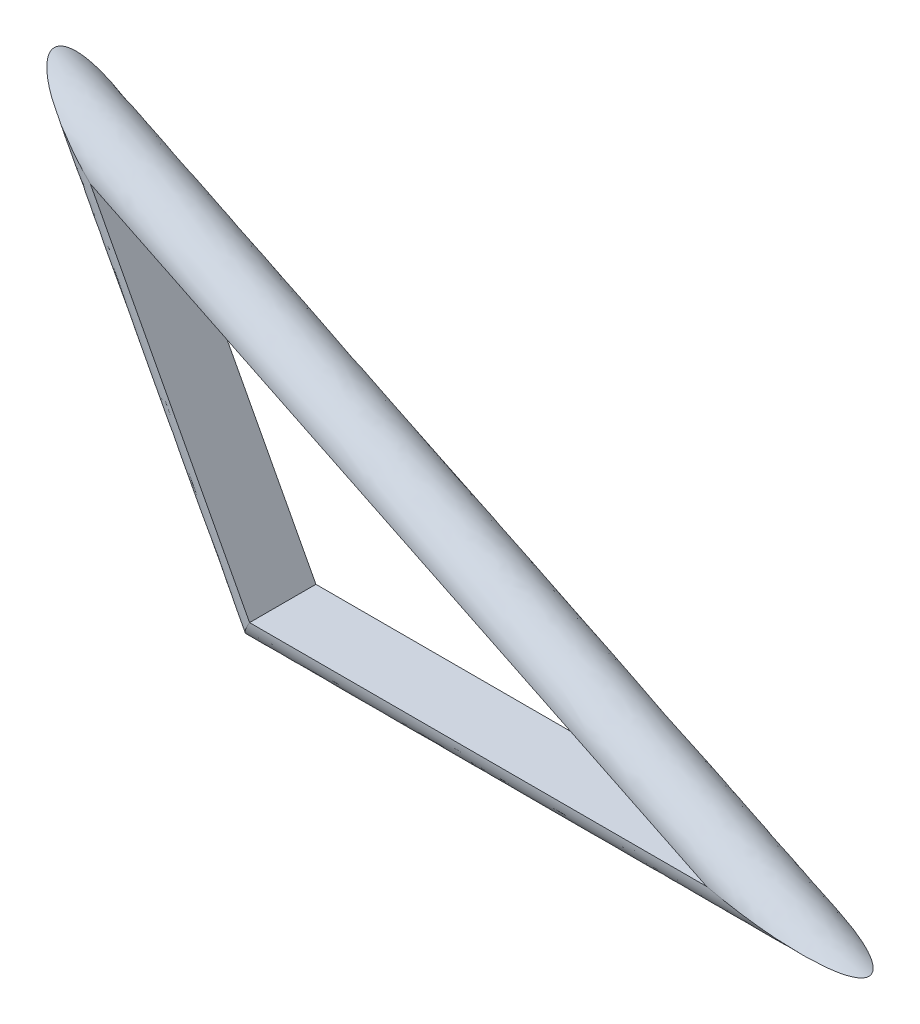
ISO-10303-21;
HEADER;
FILE_DESCRIPTION(('STEP AP214'),'2;1');
FILE_NAME('part.step','',(''),(''),'','','');
FILE_SCHEMA(('AUTOMOTIVE_DESIGN { 1 0 10303 214 1 1 1 1 }'));
ENDSEC;
DATA;
#1=APPLICATION_CONTEXT('core data for automotive mechanical design processes');
#2=APPLICATION_PROTOCOL_DEFINITION('international standard','automotive_design',2000,#1);
#3=PRODUCT_CONTEXT('',#1,'mechanical');
#4=PRODUCT('Part','Part','',(#3));
#5=PRODUCT_RELATED_PRODUCT_CATEGORY('part','',(#4));
#6=PRODUCT_DEFINITION_FORMATION('','',#4);
#7=PRODUCT_DEFINITION_CONTEXT('part definition',#1,'design');
#8=PRODUCT_DEFINITION('design','',#6,#7);
#9=PRODUCT_DEFINITION_SHAPE('','',#8);
#10=(LENGTH_UNIT() NAMED_UNIT(*) SI_UNIT(.MILLI.,.METRE.));
#11=(NAMED_UNIT(*) PLANE_ANGLE_UNIT() SI_UNIT($,.RADIAN.));
#12=(NAMED_UNIT(*) SI_UNIT($,.STERADIAN.) SOLID_ANGLE_UNIT());
#13=UNCERTAINTY_MEASURE_WITH_UNIT(LENGTH_MEASURE(1.E-05),#10,'distance_accuracy_value','');
#14=(GEOMETRIC_REPRESENTATION_CONTEXT(3) GLOBAL_UNCERTAINTY_ASSIGNED_CONTEXT((#13)) GLOBAL_UNIT_ASSIGNED_CONTEXT((#10,
#11,#12)) REPRESENTATION_CONTEXT('',''));
#15=CARTESIAN_POINT('',(0.,0.,0.));
#16=DIRECTION('',(0.,0.,1.));
#17=DIRECTION('',(1.,0.,0.));
#18=AXIS2_PLACEMENT_3D('',#15,#16,#17);
#19=CARTESIAN_POINT('',(0.240385330758788,-0.252378876025969,0.025));
#20=DIRECTION('',(0.883535213900185,0.468364735861224,0.));
#21=DIRECTION('',(-0.468364735861224,0.883535213900185,0.));
#22=AXIS2_PLACEMENT_3D('',#19,#20,#21);
#23=PLANE('',#22);
#24=DIRECTION('',(-0.468364735861224,0.883535213900185,0.));
#25=VECTOR('',#24,1.);
#26=CARTESIAN_POINT('',(0.240385330758788,-0.252378876025969,-0.025));
#27=LINE('',#26,#25);
#28=CARTESIAN_POINT('',(0.146110716191567,-0.0745368324873034,-0.025));
#29=VERTEX_POINT('',#28);
#30=CARTESIAN_POINT('',(0.0260827993900959,0.151886898902678,-0.025));
#31=VERTEX_POINT('',#30);
#32=EDGE_CURVE('E36',#29,#31,#27,.T.);
#33=ORIENTED_EDGE('',*,*,#32,.T.);
#34=DIRECTION('',(0.,0.,1.));
#35=VECTOR('',#34,1.);
#36=CARTESIAN_POINT('',(0.026082799390096,0.151886898902678,0.025));
#37=LINE('',#36,#35);
#38=CARTESIAN_POINT('',(0.0260827993900959,0.151886898902678,0.025));
#39=VERTEX_POINT('',#38);
#40=EDGE_CURVE('E77',#31,#39,#37,.T.);
#41=ORIENTED_EDGE('',*,*,#40,.T.);
#42=DIRECTION('',(-0.468364735861224,0.883535213900185,0.));
#43=VECTOR('',#42,1.);
#44=CARTESIAN_POINT('',(0.240385330758788,-0.252378876025969,0.025));
#45=LINE('',#44,#43);
#46=CARTESIAN_POINT('',(0.146110716191567,-0.0745368324873034,0.025));
#47=VERTEX_POINT('',#46);
#48=EDGE_CURVE('E78',#47,#39,#45,.T.);
#49=ORIENTED_EDGE('',*,*,#48,.F.);
#50=DIRECTION('',(0.,0.,1.));
#51=VECTOR('',#50,1.);
#52=CARTESIAN_POINT('',(0.146110716191567,-0.0745368324873033,0.025));
#53=LINE('',#52,#51);
#54=EDGE_CURVE('E70',#29,#47,#53,.T.);
#55=ORIENTED_EDGE('',*,*,#54,.F.);
#56=EDGE_LOOP('',(#33,#41,#49,#55));
#57=FACE_BOUND('',#56,.T.);
#58=ADVANCED_FACE('F33',(#57),#23,.T.);
#59=CARTESIAN_POINT('',(0.240385330758788,-0.252378876025969,-0.025));
#60=CARTESIAN_POINT('',(-0.101249699742016,0.39209018118068,-0.025));
#61=CARTESIAN_POINT('',(0.210934156962115,-0.292784672169569,-0.025));
#62=CARTESIAN_POINT('',(-0.130700873538689,0.35168438503708,-0.025));
#63=CARTESIAN_POINT('',(0.210934156962115,-0.292784672169569,0.025));
#64=CARTESIAN_POINT('',(-0.130700873538689,0.35168438503708,0.025));
#65=CARTESIAN_POINT('',(0.240385330758788,-0.252378876025969,0.025));
#66=CARTESIAN_POINT('',(-0.101249699742016,0.39209018118068,0.025));
#67=(BOUNDED_SURFACE() B_SPLINE_SURFACE(3,1,((#59,#60),(#61,#62),(#63,#64),(#65,#66)),
.UNSPECIFIED.,.F.,.F.,.F.) B_SPLINE_SURFACE_WITH_KNOTS((4,4),(2,2),(0.,1.),(0.,1.),
.UNSPECIFIED.) GEOMETRIC_REPRESENTATION_ITEM() RATIONAL_B_SPLINE_SURFACE(((1.,1.),
(0.333333333333333,0.333333333333333),(0.333333333333333,0.333333333333333),(1.,1.))) REPRESENTATION_ITEM('') SURFACE());
#68=CARTESIAN_POINT('',(0.0260827993900959,0.151886898902678,0.025));
#69=CARTESIAN_POINT('',(0.0212452123443469,0.156563061691523,0.0249595173298261));
#70=CARTESIAN_POINT('',(0.0163878933122275,0.161258298034214,0.0246691931292833));
#71=CARTESIAN_POINT('',(0.00672561969893775,0.17059815360511,0.0233532026223214));
#72=CARTESIAN_POINT('',(0.00192069525944988,0.175242743697424,0.0223271335975458));
#73=CARTESIAN_POINT('',(-0.00522989698461815,0.182154729580609,0.0200416930397302));
#74=CARTESIAN_POINT('',(-0.00763081399586112,0.184475530980433,0.0191408596321932));
#75=CARTESIAN_POINT('',(-0.0123441677477054,0.189031605984691,0.0169800016460787));
#76=CARTESIAN_POINT('',(-0.0146565540633624,0.191266830846799,0.0157197757194718));
#77=CARTESIAN_POINT('',(-0.0191302480139066,0.195591243201881,0.0126212260848398));
#78=CARTESIAN_POINT('',(-0.0212913585202532,0.197680240144255,0.0107821646257476));
#79=CARTESIAN_POINT('',(-0.0237421590081431,0.200049260464793,0.00746270391710266));
#80=CARTESIAN_POINT('',(-0.0243567776397127,0.200643370035036,0.00647775104963786));
#81=CARTESIAN_POINT('',(-0.0253682238867672,0.201621065489506,0.00427378539129839));
#82=CARTESIAN_POINT('',(-0.0257630328340156,0.202002700065174,0.00305273755924752));
#83=CARTESIAN_POINT('',(-0.0260945526814053,0.20232315756401,0.000801060796171073));
#84=CARTESIAN_POINT('',(-0.0261204540951786,0.202348194772145,-0.000201906679915384));
#85=CARTESIAN_POINT('',(-0.02592913400238,0.202163258862148,-0.00215533547276296));
#86=CARTESIAN_POINT('',(-0.0257123569382242,0.201953715356151,-0.00310588943943337));
#87=CARTESIAN_POINT('',(-0.0249514444916208,0.201218193580663,-0.00536162832657529));
#88=CARTESIAN_POINT('',(-0.0242946001511216,0.200583267325211,-0.00658707368006726));
#89=CARTESIAN_POINT('',(-0.0221961536256133,0.198554843360376,-0.0097104231851069));
#90=CARTESIAN_POINT('',(-0.0205564611011746,0.196969865333209,-0.0113188888383679));
#91=CARTESIAN_POINT('',(-0.0163124245065274,0.192867446955175,-0.0147546668892407));
#92=CARTESIAN_POINT('',(-0.0136170192017991,0.190261983970464,-0.0163292651103328));
#93=CARTESIAN_POINT('',(-0.00809612353520271,0.184925313719588,-0.0189754502592076));
#94=CARTESIAN_POINT('',(-0.0052700848043457,0.182193576382822,-0.0200446554834228));
#95=CARTESIAN_POINT('',(0.00221959604971817,0.174953816855072,-0.0223929335534931));
#96=CARTESIAN_POINT('',(0.00692784081780721,0.17040268035438,-0.0233855299319402));
#97=CARTESIAN_POINT('',(0.0164580331247462,0.161190498701322,-0.0246743591757702));
#98=CARTESIAN_POINT('',(0.0212806635547594,0.156528793445011,-0.0249614098407428));
#99=CARTESIAN_POINT('',(0.026082799390096,0.151886898902678,-0.025));
#100=B_SPLINE_CURVE_WITH_KNOTS('',3,(#68,#69,#70,#71,#72,#73,#74,#75,#76,#77,#78,#79,#80,#81,
#82,#83,#84,#85,#86,#87,#88,#89,#90,#91,#92,#93,#94,#95,#96,#97,#98,#99),.UNSPECIFIED.,.F.,.F.,
(4,2,2,2,2,2,2,2,2,2,2,2,2,2,2,4),(0.,0.0202254250854821,0.0404619292480815,0.0508175413783588,
0.0611789666294971,0.0715536518132878,0.0754376021591781,0.0793566567959513,0.0823058086322421,
0.0852495682022052,0.0897565965098291,0.0980155871224085,0.110157976806684,0.122357031592573,
0.142180337966924,0.162260296640265),.UNSPECIFIED.);
#101=EDGE_CURVE('E74',#39,#31,#100,.T.);
#102=CARTESIAN_POINT('',(0.146110716191567,-0.0745368324873033,0.025));
#103=CARTESIAN_POINT('',(0.144331256314464,-0.0774941522297804,0.0250242546048499));
#104=CARTESIAN_POINT('',(0.142553876831693,-0.0804480145256293,0.0243514494941437));
#105=CARTESIAN_POINT('',(0.139428775399666,-0.0856416827208323,0.0219287802090135));
#106=CARTESIAN_POINT('',(0.138055433955448,-0.0879240661681864,0.0203017496838993));
#107=CARTESIAN_POINT('',(0.135727825666055,-0.0917923646525961,0.0162766221399324));
#108=CARTESIAN_POINT('',(0.134761034551336,-0.0933990940222897,0.0139062531344637));
#109=CARTESIAN_POINT('',(0.133358714105299,-0.0957296382480315,0.00877611872231155));
#110=CARTESIAN_POINT('',(0.132900138094056,-0.0964917548393533,0.00604018809490719));
#111=CARTESIAN_POINT('',(0.132511956588777,-0.09713688140465,0.000540174759121129));
#112=CARTESIAN_POINT('',(0.132562176310383,-0.0970534202537753,-0.00221852921788839));
#113=CARTESIAN_POINT('',(0.133131178981821,-0.0961077833902421,-0.00750601372512839));
#114=CARTESIAN_POINT('',(0.133643617074497,-0.0952561523220651,-0.0100373987879964));
#115=CARTESIAN_POINT('',(0.135070634783173,-0.092884563224607,-0.0146853627453381));
#116=CARTESIAN_POINT('',(0.135991962442948,-0.0913533904877608,-0.0167940805205474));
#117=CARTESIAN_POINT('',(0.138166890775732,-0.0877388338682185,-0.0204193906132256));
#118=CARTESIAN_POINT('',(0.139432207242781,-0.0856359792736956,-0.0219092204257581));
#119=CARTESIAN_POINT('',(0.142204012125878,-0.0810294616340441,-0.024101940562699));
#120=CARTESIAN_POINT('',(0.143718903428608,-0.0785118336647675,-0.0247655798831701));
#121=CARTESIAN_POINT('',(0.145530550034454,-0.0755010221570654,-0.0249829848825394));
#122=CARTESIAN_POINT('',(0.145820826698386,-0.0750186055988723,-0.0250003130492533));
#123=CARTESIAN_POINT('',(0.146110716191587,-0.07453683248735,-0.025));
#124=B_SPLINE_CURVE_WITH_KNOTS('',3,(#102,#103,#104,#105,#106,#107,#108,#109,#110,#111,#112,
#113,#114,#115,#116,#117,#118,#119,#120,#121,#122,#123),.UNSPECIFIED.,.F.,.F.,(4,2,2,2,2,2,2,2,
2,2,4),(0.,0.010283040339277,0.0194667606580704,0.0283420819027494,0.0367959654024865,
0.0449159901231083,0.0529262199684417,0.0610738676691081,0.069544243033811,0.0784033324523073,
0.0800919491003776),.UNSPECIFIED.);
#125=EDGE_CURVE('E63',#47,#29,#124,.T.);
#126=ORIENTED_EDGE('',*,*,#48,.T.);
#127=ORIENTED_EDGE('',*,*,#101,.T.);
#128=ORIENTED_EDGE('',*,*,#32,.F.);
#129=ORIENTED_EDGE('',*,*,#125,.F.);
#130=EDGE_LOOP('',(#126,#127,#128,#129));
#131=FACE_BOUND('',#130,.T.);
#132=ADVANCED_FACE('F83',(#131),#67,.T.);
#133=CARTESIAN_POINT('',(0.776514944639401,-0.0745368324873033,0.025));
#134=DIRECTION('',(0.,1.,0.));
#135=DIRECTION('',(0.,0.,1.));
#136=AXIS2_PLACEMENT_3D('',#133,#134,#135);
#137=PLANE('',#136);
#138=DIRECTION('',(-1.,0.,0.));
#139=VECTOR('',#138,1.);
#140=CARTESIAN_POINT('',(0.776514944639401,-0.0745368324873033,-0.025));
#141=LINE('',#140,#139);
#142=CARTESIAN_POINT('',(0.490648268639747,-0.0745368324873033,-0.025));
#143=VERTEX_POINT('',#142);
#144=EDGE_CURVE('E97',#143,#29,#141,.T.);
#145=ORIENTED_EDGE('',*,*,#144,.T.);
#146=ORIENTED_EDGE('',*,*,#54,.T.);
#147=DIRECTION('',(-1.,0.,0.));
#148=VECTOR('',#147,1.);
#149=CARTESIAN_POINT('',(0.776514944639401,-0.0745368324873033,0.025));
#150=LINE('',#149,#148);
#151=CARTESIAN_POINT('',(0.490648268639747,-0.0745368324873033,0.025));
#152=VERTEX_POINT('',#151);
#153=EDGE_CURVE('E95',#152,#47,#150,.T.);
#154=ORIENTED_EDGE('',*,*,#153,.F.);
#155=DIRECTION('',(0.,0.,1.));
#156=VECTOR('',#155,1.);
#157=CARTESIAN_POINT('',(0.490648268639747,-0.0745368324873033,0.025));
#158=LINE('',#157,#156);
#159=EDGE_CURVE('E87',#143,#152,#158,.T.);
#160=ORIENTED_EDGE('',*,*,#159,.F.);
#161=EDGE_LOOP('',(#145,#146,#154,#160));
#162=FACE_BOUND('',#161,.T.);
#163=ADVANCED_FACE('F132',(#162),#137,.T.);
#164=CARTESIAN_POINT('',(0.776514944639401,-0.0745368324873033,-0.025));
#165=CARTESIAN_POINT('',(-0.0661269229882402,-0.0745368324873033,-0.025));
#166=CARTESIAN_POINT('',(0.798420997141863,-0.119482631665418,-0.025));
#167=CARTESIAN_POINT('',(-0.0442208704857789,-0.119482631665418,-0.025));
#168=CARTESIAN_POINT('',(0.798420997141863,-0.119482631665418,0.025));
#169=CARTESIAN_POINT('',(-0.0442208704857789,-0.119482631665418,0.025));
#170=CARTESIAN_POINT('',(0.776514944639401,-0.0745368324873033,0.025));
#171=CARTESIAN_POINT('',(-0.0661269229882402,-0.0745368324873033,0.025));
#172=(BOUNDED_SURFACE() B_SPLINE_SURFACE(3,1,((#164,#165),(#166,#167),(#168,#169),(#170,#171)),
.UNSPECIFIED.,.F.,.F.,.F.) B_SPLINE_SURFACE_WITH_KNOTS((4,4),(2,2),(0.,1.),(0.,1.),
.UNSPECIFIED.) GEOMETRIC_REPRESENTATION_ITEM() RATIONAL_B_SPLINE_SURFACE(((1.,1.),
(0.333333333333333,0.333333333333333),(0.333333333333333,0.333333333333333),(1.,1.))) REPRESENTATION_ITEM('') SURFACE());
#173=CARTESIAN_POINT('',(0.490648268639747,-0.0745368324873033,0.025));
#174=CARTESIAN_POINT('',(0.497200922416803,-0.076048671653388,0.024990238130343));
#175=CARTESIAN_POINT('',(0.503757948349941,-0.0775615195677131,0.0248288951563271));
#176=CARTESIAN_POINT('',(0.516890010646682,-0.080591370792782,0.0241403586671159));
#177=CARTESIAN_POINT('',(0.523464942303796,-0.0821083499454703,0.0236111218652788));
#178=CARTESIAN_POINT('',(0.535119003138376,-0.0847971942234327,0.0222874308847396));
#179=CARTESIAN_POINT('',(0.540207322101149,-0.0859711796300927,0.021577528860543));
#180=CARTESIAN_POINT('',(0.550323071569696,-0.0883051021413599,0.0198222833002439));
#181=CARTESIAN_POINT('',(0.555350617460093,-0.0894650658677369,0.0187777356151243));
#182=CARTESIAN_POINT('',(0.563944686101774,-0.0914479036909492,0.0165170556752238));
#183=CARTESIAN_POINT('',(0.567542709991195,-0.0922780457686435,0.0154213104844241));
#184=CARTESIAN_POINT('',(0.574485040488199,-0.0938797917404438,0.012828768031579));
#185=CARTESIAN_POINT('',(0.577833808822076,-0.0946524250555147,0.0113483143138457));
#186=CARTESIAN_POINT('',(0.582119960640778,-0.0956413332457471,0.00862790410438381));
#187=CARTESIAN_POINT('',(0.583290502381746,-0.0959114026412551,0.00778432669448615));
#188=CARTESIAN_POINT('',(0.585454122565075,-0.0964105966703711,0.00582704350154431));
#189=CARTESIAN_POINT('',(0.586445631742832,-0.0966393592395085,0.00471113338432311));
#190=CARTESIAN_POINT('',(0.587504375181581,-0.0968836342745934,0.00272884354390719));
#191=CARTESIAN_POINT('',(0.587786927619919,-0.0969488252581354,0.00199585730655291));
#192=CARTESIAN_POINT('',(0.588079216622312,-0.0970162626666527,0.000462854537082273));
#193=CARTESIAN_POINT('',(0.588087166510464,-0.0970180968666203,-0.000337567021672242));
#194=CARTESIAN_POINT('',(0.587834807733597,-0.0969598722210497,-0.00181086408928966));
#195=CARTESIAN_POINT('',(0.587598841697657,-0.0969054297461954,-0.00248871820601908));
#196=CARTESIAN_POINT('',(0.586771767402366,-0.0967146057996494,-0.00417605340154846));
#197=CARTESIAN_POINT('',(0.586049278440417,-0.0965479119581246,-0.00511195945912124));
#198=CARTESIAN_POINT('',(0.583658452746914,-0.0959962966959333,-0.00762514163411652));
#199=CARTESIAN_POINT('',(0.581756014592377,-0.0955573629843564,-0.00893478212943224));
#200=CARTESIAN_POINT('',(0.576343197472154,-0.0943085087990577,-0.0120759668006529));
#201=CARTESIAN_POINT('',(0.572680501946623,-0.0934634456161061,-0.0135815158895185));
#202=CARTESIAN_POINT('',(0.565205750232244,-0.0917388584939559,-0.0161616192560138));
#203=CARTESIAN_POINT('',(0.561393011521227,-0.090859177082025,-0.0172338720059165));
#204=CARTESIAN_POINT('',(0.548632407804589,-0.0879150293896647,-0.0203416040555932));
#205=CARTESIAN_POINT('',(0.539549774245178,-0.0858194690903901,-0.0217801423129737));
#206=CARTESIAN_POINT('',(0.523840387143006,-0.082194973204835,-0.0235709929538504));
#207=CARTESIAN_POINT('',(0.517228403849937,-0.0806694454359714,-0.0241136030011603));
#208=CARTESIAN_POINT('',(0.503961487788958,-0.0776084805239665,-0.0248267385899545));
#209=CARTESIAN_POINT('',(0.49730648586702,-0.076073027425493,-0.0249959374244211));
#210=CARTESIAN_POINT('',(0.490648268639748,-0.0745368324873034,-0.025));
#211=B_SPLINE_CURVE_WITH_KNOTS('',3,(#173,#174,#175,#176,#177,#178,#179,#180,#181,#182,#183,
#184,#185,#186,#187,#188,#189,#190,#191,#192,#193,#194,#195,#196,#197,#198,#199,#200,#201,#202,
#203,#204,#205,#206,#207,#208,#209,#210),.UNSPECIFIED.,.F.,.F.,(4,2,2,2,2,2,2,2,2,2,2,2,2,2,2,2,
2,2,4),(0.,0.0201803605920553,0.0404737081056195,0.0562785406160909,0.0720460618192259,
0.0836012941735198,0.0947288740641187,0.0991242908551651,0.103556539489745,0.105882687184881,
0.108223966911844,0.110352217089954,0.113874372891545,0.120840356905132,0.132936718381251,
0.145096512880096,0.173307932120576,0.193725127282542,0.214214747481342),.UNSPECIFIED.);
#212=EDGE_CURVE('E51',#152,#143,#211,.T.);
#213=ORIENTED_EDGE('',*,*,#153,.T.);
#214=ORIENTED_EDGE('',*,*,#125,.T.);
#215=ORIENTED_EDGE('',*,*,#144,.F.);
#216=ORIENTED_EDGE('',*,*,#212,.F.);
#217=EDGE_LOOP('',(#213,#214,#215,#216));
#218=FACE_BOUND('',#217,.T.);
#219=ADVANCED_FACE('F105',(#218),#172,.T.);
#220=CARTESIAN_POINT('',(-0.179783196712458,0.252223557757549,0.025));
#221=DIRECTION('',(-0.438121050049227,-0.898915983562292,0.));
#222=DIRECTION('',(0.898915983562292,-0.438121050049227,0.));
#223=AXIS2_PLACEMENT_3D('',#220,#221,#222);
#224=PLANE('',#223);
#225=ORIENTED_EDGE('',*,*,#40,.F.);
#226=DIRECTION('',(0.898915983562292,-0.438121050049227,0.));
#227=VECTOR('',#226,1.);
#228=CARTESIAN_POINT('',(-0.179783196712458,0.252223557757549,-0.025));
#229=LINE('',#228,#227);
#230=EDGE_CURVE('E11',#31,#143,#229,.T.);
#231=ORIENTED_EDGE('',*,*,#230,.T.);
#232=ORIENTED_EDGE('',*,*,#159,.T.);
#233=DIRECTION('',(0.898915983562292,-0.438121050049227,0.));
#234=VECTOR('',#233,1.);
#235=CARTESIAN_POINT('',(-0.179783196712458,0.252223557757549,0.025));
#236=LINE('',#235,#234);
#237=EDGE_CURVE('E42',#39,#152,#236,.T.);
#238=ORIENTED_EDGE('',*,*,#237,.F.);
#239=EDGE_LOOP('',(#225,#231,#232,#238));
#240=FACE_BOUND('',#239,.T.);
#241=ADVANCED_FACE('F90',(#240),#224,.T.);
#242=CARTESIAN_POINT('',(-0.179783196712458,0.252223557757549,-0.025));
#243=CARTESIAN_POINT('',(0.789955549435776,-0.220415671608699,-0.025));
#244=CARTESIAN_POINT('',(-0.179783196712458,0.302223557757549,-0.025));
#245=CARTESIAN_POINT('',(0.789955549435776,-0.170415671608699,-0.025));
#246=CARTESIAN_POINT('',(-0.179783196712458,0.302223557757549,0.025));
#247=CARTESIAN_POINT('',(0.789955549435776,-0.170415671608699,0.025));
#248=CARTESIAN_POINT('',(-0.179783196712458,0.252223557757549,0.025));
#249=CARTESIAN_POINT('',(0.789955549435776,-0.220415671608699,0.025));
#250=(BOUNDED_SURFACE() B_SPLINE_SURFACE(3,1,((#242,#243),(#244,#245),(#246,#247),(#248,#249)),
.UNSPECIFIED.,.F.,.F.,.F.) B_SPLINE_SURFACE_WITH_KNOTS((4,4),(2,2),(0.,1.),(0.,1.),
.UNSPECIFIED.) GEOMETRIC_REPRESENTATION_ITEM() RATIONAL_B_SPLINE_SURFACE(((1.,1.),
(0.333333333333333,0.333333333333333),(0.333333333333333,0.333333333333333),(1.,1.))) REPRESENTATION_ITEM('') SURFACE());
#251=ORIENTED_EDGE('',*,*,#101,.F.);
#252=ORIENTED_EDGE('',*,*,#237,.T.);
#253=ORIENTED_EDGE('',*,*,#212,.T.);
#254=ORIENTED_EDGE('',*,*,#230,.F.);
#255=EDGE_LOOP('',(#251,#252,#253,#254));
#256=FACE_BOUND('',#255,.T.);
#257=ADVANCED_FACE('F86',(#256),#250,.T.);
#258=CLOSED_SHELL('',(#58,#132,#163,#219,#241,#257));
#259=MANIFOLD_SOLID_BREP('B2',#258);
#260=ADVANCED_BREP_SHAPE_REPRESENTATION('',(#18,#259),#14);
#261=SHAPE_DEFINITION_REPRESENTATION(#9,#260);
ENDSEC;
END-ISO-10303-21;
